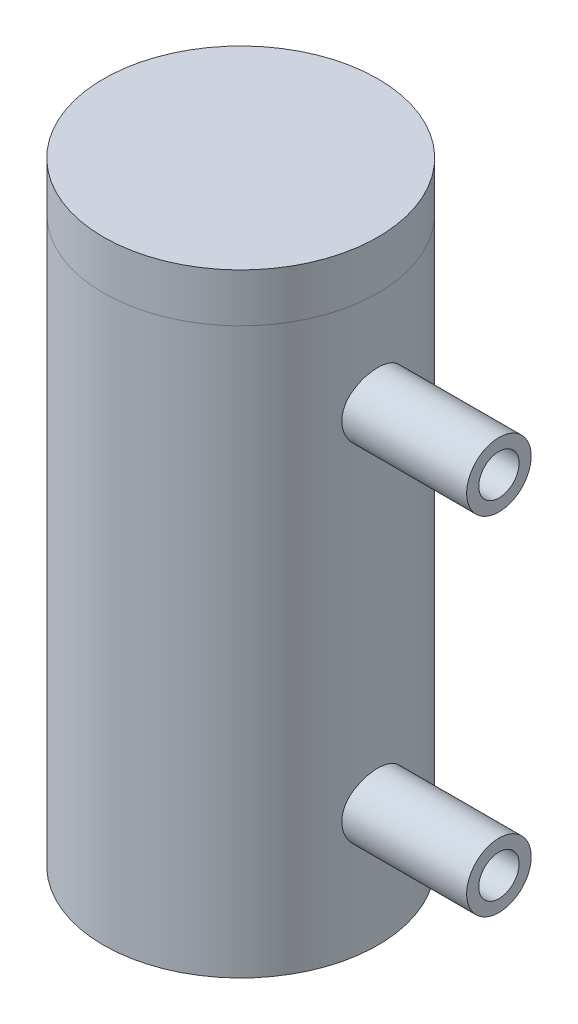
ISO-10303-21;
HEADER;
FILE_DESCRIPTION(('STEP AP214'),'2;1');
FILE_NAME('part.step','',(''),(''),'','','');
FILE_SCHEMA(('AUTOMOTIVE_DESIGN { 1 0 10303 214 1 1 1 1 }'));
ENDSEC;
DATA;
#1=APPLICATION_CONTEXT('core data for automotive mechanical design processes');
#2=APPLICATION_PROTOCOL_DEFINITION('international standard','automotive_design',2000,#1);
#3=PRODUCT_CONTEXT('',#1,'mechanical');
#4=PRODUCT('Part','Part','',(#3));
#5=PRODUCT_RELATED_PRODUCT_CATEGORY('part','',(#4));
#6=PRODUCT_DEFINITION_FORMATION('','',#4);
#7=PRODUCT_DEFINITION_CONTEXT('part definition',#1,'design');
#8=PRODUCT_DEFINITION('design','',#6,#7);
#9=PRODUCT_DEFINITION_SHAPE('','',#8);
#10=(LENGTH_UNIT() NAMED_UNIT(*) SI_UNIT(.MILLI.,.METRE.));
#11=(NAMED_UNIT(*) PLANE_ANGLE_UNIT() SI_UNIT($,.RADIAN.));
#12=(NAMED_UNIT(*) SI_UNIT($,.STERADIAN.) SOLID_ANGLE_UNIT());
#13=UNCERTAINTY_MEASURE_WITH_UNIT(LENGTH_MEASURE(1.E-05),#10,'distance_accuracy_value','');
#14=(GEOMETRIC_REPRESENTATION_CONTEXT(3) GLOBAL_UNCERTAINTY_ASSIGNED_CONTEXT((#13)) GLOBAL_UNIT_ASSIGNED_CONTEXT((#10,
#11,#12)) REPRESENTATION_CONTEXT('',''));
#15=CARTESIAN_POINT('',(0.,0.,0.));
#16=DIRECTION('',(0.,0.,1.));
#17=DIRECTION('',(1.,0.,0.));
#18=AXIS2_PLACEMENT_3D('',#15,#16,#17);
#19=CARTESIAN_POINT('',(61.,468.,498.));
#20=DIRECTION('',(-1.,0.,0.));
#21=DIRECTION('',(0.,0.,1.));
#22=AXIS2_PLACEMENT_3D('',#19,#20,#21);
#23=CYLINDRICAL_SURFACE('',#22,4.);
#24=CARTESIAN_POINT('',(61.,468.,498.));
#25=DIRECTION('',(1.,0.,0.));
#26=DIRECTION('',(0.,0.,-1.));
#27=AXIS2_PLACEMENT_3D('',#24,#25,#26);
#28=CIRCLE('',#27,4.);
#29=CARTESIAN_POINT('',(61.,468.,494.));
#30=VERTEX_POINT('',#29);
#31=EDGE_CURVE('E11',#30,#30,#28,.T.);
#32=ORIENTED_EDGE('',*,*,#31,.F.);
#33=EDGE_LOOP('',(#32));
#34=FACE_BOUND('',#33,.T.);
#35=CARTESIAN_POINT('',(44.5,468.,498.));
#36=DIRECTION('',(1.,0.,0.));
#37=DIRECTION('',(0.,0.,-1.));
#38=AXIS2_PLACEMENT_3D('',#35,#36,#37);
#39=CIRCLE('',#38,4.);
#40=CARTESIAN_POINT('',(44.5,468.,494.));
#41=VERTEX_POINT('',#40);
#42=EDGE_CURVE('E55',#41,#41,#39,.T.);
#43=ORIENTED_EDGE('',*,*,#42,.T.);
#44=EDGE_LOOP('',(#43));
#45=FACE_BOUND('',#44,.T.);
#46=ADVANCED_FACE('F48',(#34,#45),#23,.T.);
#47=CARTESIAN_POINT('',(61.,468.,498.));
#48=DIRECTION('',(1.,0.,0.));
#49=DIRECTION('',(0.,0.,-1.));
#50=AXIS2_PLACEMENT_3D('',#47,#48,#49);
#51=PLANE('',#50);
#52=CARTESIAN_POINT('',(61.,468.,498.));
#53=DIRECTION('',(1.,0.,0.));
#54=DIRECTION('',(0.,0.,-1.));
#55=AXIS2_PLACEMENT_3D('',#52,#53,#54);
#56=CIRCLE('',#55,2.5);
#57=CARTESIAN_POINT('',(61.,468.,495.5));
#58=VERTEX_POINT('',#57);
#59=EDGE_CURVE('E60',#58,#58,#56,.F.);
#60=ORIENTED_EDGE('',*,*,#59,.T.);
#61=EDGE_LOOP('',(#60));
#62=FACE_BOUND('',#61,.T.);
#63=ORIENTED_EDGE('',*,*,#31,.T.);
#64=EDGE_LOOP('',(#63));
#65=FACE_BOUND('',#64,.T.);
#66=ADVANCED_FACE('F73',(#62,#65),#51,.T.);
#67=CARTESIAN_POINT('',(44.5,468.,498.));
#68=DIRECTION('',(1.,0.,0.));
#69=DIRECTION('',(0.,0.,-1.));
#70=AXIS2_PLACEMENT_3D('',#67,#68,#69);
#71=PLANE('',#70);
#72=CARTESIAN_POINT('',(44.5,468.,498.));
#73=DIRECTION('',(1.,0.,0.));
#74=DIRECTION('',(0.,0.,-1.));
#75=AXIS2_PLACEMENT_3D('',#72,#73,#74);
#76=CIRCLE('',#75,2.5);
#77=CARTESIAN_POINT('',(44.5,468.,495.5));
#78=VERTEX_POINT('',#77);
#79=EDGE_CURVE('E51',#78,#78,#76,.F.);
#80=ORIENTED_EDGE('',*,*,#79,.F.);
#81=EDGE_LOOP('',(#80));
#82=FACE_BOUND('',#81,.T.);
#83=ORIENTED_EDGE('',*,*,#42,.F.);
#84=EDGE_LOOP('',(#83));
#85=FACE_BOUND('',#84,.T.);
#86=ADVANCED_FACE('F70',(#82,#85),#71,.F.);
#87=CARTESIAN_POINT('',(62.,468.,498.));
#88=DIRECTION('',(-1.,0.,0.));
#89=DIRECTION('',(0.,0.,1.));
#90=AXIS2_PLACEMENT_3D('',#87,#88,#89);
#91=CYLINDRICAL_SURFACE('',#90,2.5);
#92=ORIENTED_EDGE('',*,*,#59,.F.);
#93=EDGE_LOOP('',(#92));
#94=FACE_BOUND('',#93,.T.);
#95=ORIENTED_EDGE('',*,*,#79,.T.);
#96=EDGE_LOOP('',(#95));
#97=FACE_BOUND('',#96,.T.);
#98=ADVANCED_FACE('F68',(#94,#97),#91,.F.);
#99=CLOSED_SHELL('',(#46,#66,#86,#98));
#100=MANIFOLD_SOLID_BREP('B2',#99);
#101=CARTESIAN_POINT('',(61.,425.,498.));
#102=DIRECTION('',(-1.,0.,0.));
#103=DIRECTION('',(0.,0.,1.));
#104=AXIS2_PLACEMENT_3D('',#101,#102,#103);
#105=CYLINDRICAL_SURFACE('',#104,4.);
#106=CARTESIAN_POINT('',(61.,425.,498.));
#107=DIRECTION('',(1.,0.,0.));
#108=DIRECTION('',(0.,0.,-1.));
#109=AXIS2_PLACEMENT_3D('',#106,#107,#108);
#110=CIRCLE('',#109,4.);
#111=CARTESIAN_POINT('',(61.,425.,494.));
#112=VERTEX_POINT('',#111);
#113=EDGE_CURVE('E47',#112,#112,#110,.T.);
#114=ORIENTED_EDGE('',*,*,#113,.F.);
#115=EDGE_LOOP('',(#114));
#116=FACE_BOUND('',#115,.T.);
#117=CARTESIAN_POINT('',(44.5,425.,498.));
#118=DIRECTION('',(1.,0.,0.));
#119=DIRECTION('',(0.,0.,-1.));
#120=AXIS2_PLACEMENT_3D('',#117,#118,#119);
#121=CIRCLE('',#120,4.);
#122=CARTESIAN_POINT('',(44.5,425.,494.));
#123=VERTEX_POINT('',#122);
#124=EDGE_CURVE('E128',#123,#123,#121,.T.);
#125=ORIENTED_EDGE('',*,*,#124,.T.);
#126=EDGE_LOOP('',(#125));
#127=FACE_BOUND('',#126,.T.);
#128=ADVANCED_FACE('F121',(#116,#127),#105,.T.);
#129=CARTESIAN_POINT('',(61.,425.,498.));
#130=DIRECTION('',(1.,0.,0.));
#131=DIRECTION('',(0.,0.,-1.));
#132=AXIS2_PLACEMENT_3D('',#129,#130,#131);
#133=PLANE('',#132);
#134=CARTESIAN_POINT('',(61.,425.,498.));
#135=DIRECTION('',(1.,0.,0.));
#136=DIRECTION('',(0.,0.,-1.));
#137=AXIS2_PLACEMENT_3D('',#134,#135,#136);
#138=CIRCLE('',#137,2.5);
#139=CARTESIAN_POINT('',(61.,425.,495.5));
#140=VERTEX_POINT('',#139);
#141=EDGE_CURVE('E133',#140,#140,#138,.F.);
#142=ORIENTED_EDGE('',*,*,#141,.T.);
#143=EDGE_LOOP('',(#142));
#144=FACE_BOUND('',#143,.T.);
#145=ORIENTED_EDGE('',*,*,#113,.T.);
#146=EDGE_LOOP('',(#145));
#147=FACE_BOUND('',#146,.T.);
#148=ADVANCED_FACE('F146',(#144,#147),#133,.T.);
#149=CARTESIAN_POINT('',(44.5,425.,498.));
#150=DIRECTION('',(1.,0.,0.));
#151=DIRECTION('',(0.,0.,-1.));
#152=AXIS2_PLACEMENT_3D('',#149,#150,#151);
#153=PLANE('',#152);
#154=CARTESIAN_POINT('',(44.5,425.,498.));
#155=DIRECTION('',(1.,0.,0.));
#156=DIRECTION('',(0.,0.,-1.));
#157=AXIS2_PLACEMENT_3D('',#154,#155,#156);
#158=CIRCLE('',#157,2.5);
#159=CARTESIAN_POINT('',(44.5,425.,495.5));
#160=VERTEX_POINT('',#159);
#161=EDGE_CURVE('E124',#160,#160,#158,.F.);
#162=ORIENTED_EDGE('',*,*,#161,.F.);
#163=EDGE_LOOP('',(#162));
#164=FACE_BOUND('',#163,.T.);
#165=ORIENTED_EDGE('',*,*,#124,.F.);
#166=EDGE_LOOP('',(#165));
#167=FACE_BOUND('',#166,.T.);
#168=ADVANCED_FACE('F143',(#164,#167),#153,.F.);
#169=CARTESIAN_POINT('',(62.,425.,498.));
#170=DIRECTION('',(-1.,0.,0.));
#171=DIRECTION('',(0.,0.,1.));
#172=AXIS2_PLACEMENT_3D('',#169,#170,#171);
#173=CYLINDRICAL_SURFACE('',#172,2.5);
#174=ORIENTED_EDGE('',*,*,#141,.F.);
#175=EDGE_LOOP('',(#174));
#176=FACE_BOUND('',#175,.T.);
#177=ORIENTED_EDGE('',*,*,#161,.T.);
#178=EDGE_LOOP('',(#177));
#179=FACE_BOUND('',#178,.T.);
#180=ADVANCED_FACE('F141',(#176,#179),#173,.F.);
#181=CLOSED_SHELL('',(#128,#148,#168,#180));
#182=MANIFOLD_SOLID_BREP('B6',#181);
#183=CARTESIAN_POINT('',(29.,486.,498.));
#184=DIRECTION('',(0.,-1.,0.));
#185=DIRECTION('',(0.,0.,-1.));
#186=AXIS2_PLACEMENT_3D('',#183,#184,#185);
#187=CYLINDRICAL_SURFACE('',#186,17.);
#188=CARTESIAN_POINT('',(29.,486.,498.));
#189=DIRECTION('',(0.,1.,0.));
#190=DIRECTION('',(0.,0.,1.));
#191=AXIS2_PLACEMENT_3D('',#188,#189,#190);
#192=CIRCLE('',#191,17.);
#193=CARTESIAN_POINT('',(29.,486.,515.));
#194=VERTEX_POINT('',#193);
#195=EDGE_CURVE('E120',#194,#194,#192,.T.);
#196=ORIENTED_EDGE('',*,*,#195,.F.);
#197=EDGE_LOOP('',(#196));
#198=FACE_BOUND('',#197,.T.);
#199=CARTESIAN_POINT('',(29.,480.,498.));
#200=DIRECTION('',(0.,1.,0.));
#201=DIRECTION('',(0.,0.,1.));
#202=AXIS2_PLACEMENT_3D('',#199,#200,#201);
#203=CIRCLE('',#202,17.);
#204=CARTESIAN_POINT('',(29.,480.,515.));
#205=VERTEX_POINT('',#204);
#206=EDGE_CURVE('E196',#205,#205,#203,.T.);
#207=ORIENTED_EDGE('',*,*,#206,.T.);
#208=EDGE_LOOP('',(#207));
#209=FACE_BOUND('',#208,.T.);
#210=ADVANCED_FACE('F193',(#198,#209),#187,.T.);
#211=CARTESIAN_POINT('',(29.,486.,498.));
#212=DIRECTION('',(0.,1.,0.));
#213=DIRECTION('',(0.,0.,1.));
#214=AXIS2_PLACEMENT_3D('',#211,#212,#213);
#215=PLANE('',#214);
#216=ORIENTED_EDGE('',*,*,#195,.T.);
#217=EDGE_LOOP('',(#216));
#218=FACE_BOUND('',#217,.T.);
#219=ADVANCED_FACE('F208',(#218),#215,.T.);
#220=CARTESIAN_POINT('',(29.,480.,498.));
#221=DIRECTION('',(0.,1.,0.));
#222=DIRECTION('',(0.,0.,1.));
#223=AXIS2_PLACEMENT_3D('',#220,#221,#222);
#224=PLANE('',#223);
#225=ORIENTED_EDGE('',*,*,#206,.F.);
#226=EDGE_LOOP('',(#225));
#227=FACE_BOUND('',#226,.T.);
#228=ADVANCED_FACE('F206',(#227),#224,.F.);
#229=CLOSED_SHELL('',(#210,#219,#228));
#230=MANIFOLD_SOLID_BREP('B42',#229);
#231=CARTESIAN_POINT('',(29.,480.,498.));
#232=DIRECTION('',(0.,-1.,0.));
#233=DIRECTION('',(0.,0.,-1.));
#234=AXIS2_PLACEMENT_3D('',#231,#232,#233);
#235=CYLINDRICAL_SURFACE('',#234,17.);
#236=CARTESIAN_POINT('',(29.,480.,498.));
#237=DIRECTION('',(0.,1.,0.));
#238=DIRECTION('',(0.,0.,1.));
#239=AXIS2_PLACEMENT_3D('',#236,#237,#238);
#240=CIRCLE('',#239,17.);
#241=CARTESIAN_POINT('',(29.,480.,515.));
#242=VERTEX_POINT('',#241);
#243=EDGE_CURVE('E192',#242,#242,#240,.T.);
#244=ORIENTED_EDGE('',*,*,#243,.F.);
#245=EDGE_LOOP('',(#244));
#246=FACE_BOUND('',#245,.T.);
#247=CARTESIAN_POINT('',(29.,410.,498.));
#248=DIRECTION('',(0.,1.,0.));
#249=DIRECTION('',(0.,0.,1.));
#250=AXIS2_PLACEMENT_3D('',#247,#248,#249);
#251=CIRCLE('',#250,17.);
#252=CARTESIAN_POINT('',(29.,410.,515.));
#253=VERTEX_POINT('',#252);
#254=EDGE_CURVE('E241',#253,#253,#251,.T.);
#255=ORIENTED_EDGE('',*,*,#254,.T.);
#256=EDGE_LOOP('',(#255));
#257=FACE_BOUND('',#256,.T.);
#258=ADVANCED_FACE('F234',(#246,#257),#235,.T.);
#259=CARTESIAN_POINT('',(29.,480.,498.));
#260=DIRECTION('',(0.,1.,0.));
#261=DIRECTION('',(0.,0.,1.));
#262=AXIS2_PLACEMENT_3D('',#259,#260,#261);
#263=PLANE('',#262);
#264=CARTESIAN_POINT('',(29.,480.,498.));
#265=DIRECTION('',(0.,1.,0.));
#266=DIRECTION('',(0.,0.,1.));
#267=AXIS2_PLACEMENT_3D('',#264,#265,#266);
#268=CIRCLE('',#267,15.);
#269=CARTESIAN_POINT('',(29.,480.,513.));
#270=VERTEX_POINT('',#269);
#271=EDGE_CURVE('E246',#270,#270,#268,.F.);
#272=ORIENTED_EDGE('',*,*,#271,.T.);
#273=EDGE_LOOP('',(#272));
#274=FACE_BOUND('',#273,.T.);
#275=ORIENTED_EDGE('',*,*,#243,.T.);
#276=EDGE_LOOP('',(#275));
#277=FACE_BOUND('',#276,.T.);
#278=ADVANCED_FACE('F259',(#274,#277),#263,.T.);
#279=CARTESIAN_POINT('',(29.,410.,498.));
#280=DIRECTION('',(0.,1.,0.));
#281=DIRECTION('',(0.,0.,1.));
#282=AXIS2_PLACEMENT_3D('',#279,#280,#281);
#283=PLANE('',#282);
#284=CARTESIAN_POINT('',(29.,410.,498.));
#285=DIRECTION('',(0.,1.,0.));
#286=DIRECTION('',(0.,0.,1.));
#287=AXIS2_PLACEMENT_3D('',#284,#285,#286);
#288=CIRCLE('',#287,15.);
#289=CARTESIAN_POINT('',(29.,410.,513.));
#290=VERTEX_POINT('',#289);
#291=EDGE_CURVE('E237',#290,#290,#288,.F.);
#292=ORIENTED_EDGE('',*,*,#291,.F.);
#293=EDGE_LOOP('',(#292));
#294=FACE_BOUND('',#293,.T.);
#295=ORIENTED_EDGE('',*,*,#254,.F.);
#296=EDGE_LOOP('',(#295));
#297=FACE_BOUND('',#296,.T.);
#298=ADVANCED_FACE('F256',(#294,#297),#283,.F.);
#299=CARTESIAN_POINT('',(29.,481.,498.));
#300=DIRECTION('',(0.,-1.,0.));
#301=DIRECTION('',(0.,0.,-1.));
#302=AXIS2_PLACEMENT_3D('',#299,#300,#301);
#303=CYLINDRICAL_SURFACE('',#302,15.);
#304=ORIENTED_EDGE('',*,*,#271,.F.);
#305=EDGE_LOOP('',(#304));
#306=FACE_BOUND('',#305,.T.);
#307=ORIENTED_EDGE('',*,*,#291,.T.);
#308=EDGE_LOOP('',(#307));
#309=FACE_BOUND('',#308,.T.);
#310=ADVANCED_FACE('F254',(#306,#309),#303,.F.);
#311=CLOSED_SHELL('',(#258,#278,#298,#310));
#312=MANIFOLD_SOLID_BREP('B115',#311);
#313=ADVANCED_BREP_SHAPE_REPRESENTATION('',(#18,#100,#182,#230,#312),#14);
#314=SHAPE_DEFINITION_REPRESENTATION(#9,#313);
ENDSEC;
END-ISO-10303-21;
